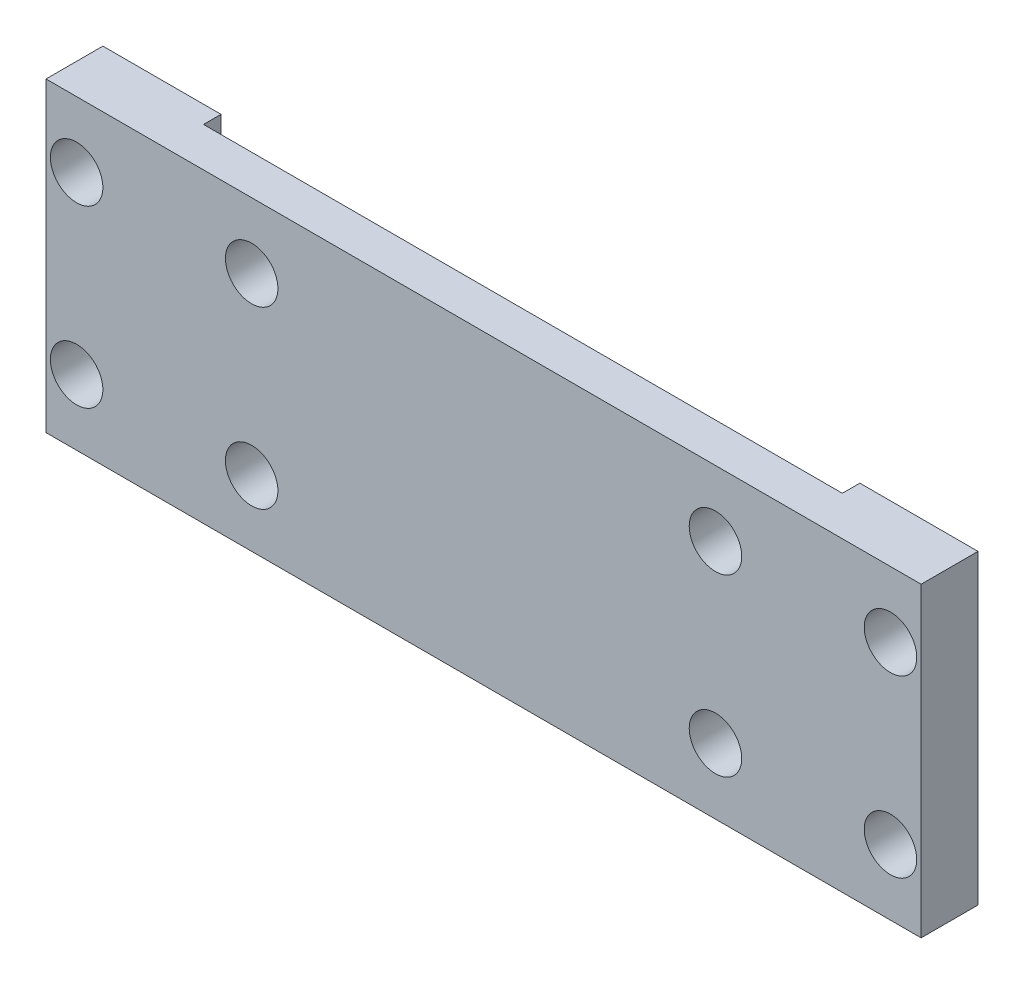
ISO-10303-21;
HEADER;
FILE_DESCRIPTION(('STEP AP214'),'2;1');
FILE_NAME('part.step','',(''),(''),'','','');
FILE_SCHEMA(('AUTOMOTIVE_DESIGN { 1 0 10303 214 1 1 1 1 }'));
ENDSEC;
DATA;
#1=APPLICATION_CONTEXT('core data for automotive mechanical design processes');
#2=APPLICATION_PROTOCOL_DEFINITION('international standard','automotive_design',2000,#1);
#3=PRODUCT_CONTEXT('',#1,'mechanical');
#4=PRODUCT('Part','Part','',(#3));
#5=PRODUCT_RELATED_PRODUCT_CATEGORY('part','',(#4));
#6=PRODUCT_DEFINITION_FORMATION('','',#4);
#7=PRODUCT_DEFINITION_CONTEXT('part definition',#1,'design');
#8=PRODUCT_DEFINITION('design','',#6,#7);
#9=PRODUCT_DEFINITION_SHAPE('','',#8);
#10=(LENGTH_UNIT() NAMED_UNIT(*) SI_UNIT(.MILLI.,.METRE.));
#11=(NAMED_UNIT(*) PLANE_ANGLE_UNIT() SI_UNIT($,.RADIAN.));
#12=(NAMED_UNIT(*) SI_UNIT($,.STERADIAN.) SOLID_ANGLE_UNIT());
#13=UNCERTAINTY_MEASURE_WITH_UNIT(LENGTH_MEASURE(1.E-05),#10,'distance_accuracy_value','');
#14=(GEOMETRIC_REPRESENTATION_CONTEXT(3) GLOBAL_UNCERTAINTY_ASSIGNED_CONTEXT((#13)) GLOBAL_UNIT_ASSIGNED_CONTEXT((#10,
#11,#12)) REPRESENTATION_CONTEXT('',''));
#15=CARTESIAN_POINT('',(0.,0.,0.));
#16=DIRECTION('',(0.,0.,1.));
#17=DIRECTION('',(1.,0.,0.));
#18=AXIS2_PLACEMENT_3D('',#15,#16,#17);
#19=CARTESIAN_POINT('',(0.,0.,2.));
#20=DIRECTION('',(0.,0.,1.));
#21=DIRECTION('',(1.,0.,0.));
#22=AXIS2_PLACEMENT_3D('',#19,#20,#21);
#23=PLANE('',#22);
#24=CARTESIAN_POINT('',(-26.5,-7.5,2.));
#25=DIRECTION('',(0.,0.,1.));
#26=DIRECTION('',(1.,0.,0.));
#27=AXIS2_PLACEMENT_3D('',#24,#25,#26);
#28=CIRCLE('',#27,3.);
#29=CARTESIAN_POINT('',(-23.5,-7.5,2.));
#30=VERTEX_POINT('',#29);
#31=EDGE_CURVE('E232',#30,#30,#28,.T.);
#32=ORIENTED_EDGE('',*,*,#31,.T.);
#33=EDGE_LOOP('',(#32));
#34=FACE_BOUND('',#33,.T.);
#35=CARTESIAN_POINT('',(-26.5,-27.5,2.));
#36=DIRECTION('',(0.,0.,1.));
#37=DIRECTION('',(1.,0.,0.));
#38=AXIS2_PLACEMENT_3D('',#35,#36,#37);
#39=CIRCLE('',#38,3.);
#40=CARTESIAN_POINT('',(-23.5,-27.5,2.));
#41=VERTEX_POINT('',#40);
#42=EDGE_CURVE('E226',#41,#41,#39,.T.);
#43=ORIENTED_EDGE('',*,*,#42,.T.);
#44=EDGE_LOOP('',(#43));
#45=FACE_BOUND('',#44,.T.);
#46=CARTESIAN_POINT('',(26.5,-27.5,2.));
#47=DIRECTION('',(0.,0.,1.));
#48=DIRECTION('',(-1.,0.,0.));
#49=AXIS2_PLACEMENT_3D('',#46,#47,#48);
#50=CIRCLE('',#49,3.);
#51=CARTESIAN_POINT('',(23.5,-27.5,2.));
#52=VERTEX_POINT('',#51);
#53=EDGE_CURVE('E220',#52,#52,#50,.T.);
#54=ORIENTED_EDGE('',*,*,#53,.T.);
#55=EDGE_LOOP('',(#54));
#56=FACE_BOUND('',#55,.T.);
#57=CARTESIAN_POINT('',(26.5,-7.49999999999999,2.));
#58=DIRECTION('',(0.,0.,1.));
#59=DIRECTION('',(-1.,0.,0.));
#60=AXIS2_PLACEMENT_3D('',#57,#58,#59);
#61=CIRCLE('',#60,3.);
#62=CARTESIAN_POINT('',(23.5,-7.49999999999999,2.));
#63=VERTEX_POINT('',#62);
#64=EDGE_CURVE('E214',#63,#63,#61,.T.);
#65=ORIENTED_EDGE('',*,*,#64,.T.);
#66=EDGE_LOOP('',(#65));
#67=FACE_BOUND('',#66,.T.);
#68=DIRECTION('',(0.,-1.,0.));
#69=VECTOR('',#68,1.);
#70=CARTESIAN_POINT('',(36.5,0.,2.));
#71=LINE('',#70,#69);
#72=CARTESIAN_POINT('',(36.5,0.,2.));
#73=VERTEX_POINT('',#72);
#74=CARTESIAN_POINT('',(36.5,-35.,2.));
#75=VERTEX_POINT('',#74);
#76=EDGE_CURVE('E113',#73,#75,#71,.T.);
#77=ORIENTED_EDGE('',*,*,#76,.T.);
#78=DIRECTION('',(1.,0.,0.));
#79=VECTOR('',#78,1.);
#80=CARTESIAN_POINT('',(-50.,-35.,2.));
#81=LINE('',#80,#79);
#82=CARTESIAN_POINT('',(-36.5,-35.,2.));
#83=VERTEX_POINT('',#82);
#84=EDGE_CURVE('E110',#83,#75,#81,.T.);
#85=ORIENTED_EDGE('',*,*,#84,.F.);
#86=DIRECTION('',(0.,1.,0.));
#87=VECTOR('',#86,1.);
#88=CARTESIAN_POINT('',(-36.5,0.,2.));
#89=LINE('',#88,#87);
#90=CARTESIAN_POINT('',(-36.5,0.,2.));
#91=VERTEX_POINT('',#90);
#92=EDGE_CURVE('E98',#83,#91,#89,.T.);
#93=ORIENTED_EDGE('',*,*,#92,.T.);
#94=DIRECTION('',(-1.,0.,0.));
#95=VECTOR('',#94,1.);
#96=CARTESIAN_POINT('',(-50.,0.,2.));
#97=LINE('',#96,#95);
#98=EDGE_CURVE('E115',#73,#91,#97,.T.);
#99=ORIENTED_EDGE('',*,*,#98,.F.);
#100=EDGE_LOOP('',(#77,#85,#93,#99));
#101=FACE_BOUND('',#100,.T.);
#102=ADVANCED_FACE('F41',(#34,#45,#56,#67,#101),#23,.F.);
#103=CARTESIAN_POINT('',(0.,0.,2.));
#104=DIRECTION('',(0.,0.,-1.));
#105=DIRECTION('',(-1.,0.,0.));
#106=AXIS2_PLACEMENT_3D('',#103,#104,#105);
#107=PLANE('',#106);
#108=CARTESIAN_POINT('',(-46.5,-7.5,2.));
#109=DIRECTION('',(0.,0.,1.));
#110=DIRECTION('',(1.,0.,0.));
#111=AXIS2_PLACEMENT_3D('',#108,#109,#110);
#112=CIRCLE('',#111,1.75);
#113=CARTESIAN_POINT('',(-44.75,-7.5,2.));
#114=VERTEX_POINT('',#113);
#115=EDGE_CURVE('E141',#114,#114,#112,.T.);
#116=ORIENTED_EDGE('',*,*,#115,.F.);
#117=EDGE_LOOP('',(#116));
#118=FACE_BOUND('',#117,.T.);
#119=CARTESIAN_POINT('',(-46.5,-7.5,2.));
#120=DIRECTION('',(0.,0.,1.));
#121=DIRECTION('',(1.,0.,0.));
#122=AXIS2_PLACEMENT_3D('',#119,#120,#121);
#123=CIRCLE('',#122,3.);
#124=CARTESIAN_POINT('',(-43.5,-7.5,2.));
#125=VERTEX_POINT('',#124);
#126=EDGE_CURVE('E122',#125,#125,#123,.T.);
#127=ORIENTED_EDGE('',*,*,#126,.T.);
#128=EDGE_LOOP('',(#127));
#129=FACE_BOUND('',#128,.T.);
#130=ADVANCED_FACE('F263',(#118,#129),#107,.F.);
#131=CARTESIAN_POINT('',(-46.5,-27.5,2.));
#132=DIRECTION('',(0.,0.,1.));
#133=DIRECTION('',(1.,0.,0.));
#134=AXIS2_PLACEMENT_3D('',#131,#132,#133);
#135=CIRCLE('',#134,1.75);
#136=CARTESIAN_POINT('',(-44.75,-27.5,2.));
#137=VERTEX_POINT('',#136);
#138=EDGE_CURVE('E135',#137,#137,#135,.T.);
#139=ORIENTED_EDGE('',*,*,#138,.F.);
#140=EDGE_LOOP('',(#139));
#141=FACE_BOUND('',#140,.T.);
#142=CARTESIAN_POINT('',(-46.5,-27.5,2.));
#143=DIRECTION('',(0.,0.,1.));
#144=DIRECTION('',(1.,0.,0.));
#145=AXIS2_PLACEMENT_3D('',#142,#143,#144);
#146=CIRCLE('',#145,3.);
#147=CARTESIAN_POINT('',(-43.5,-27.5,2.));
#148=VERTEX_POINT('',#147);
#149=EDGE_CURVE('E250',#148,#148,#146,.T.);
#150=ORIENTED_EDGE('',*,*,#149,.T.);
#151=EDGE_LOOP('',(#150));
#152=FACE_BOUND('',#151,.T.);
#153=ADVANCED_FACE('F286',(#141,#152),#107,.F.);
#154=CARTESIAN_POINT('',(0.,0.,0.));
#155=DIRECTION('',(0.,0.,-1.));
#156=DIRECTION('',(-1.,0.,0.));
#157=AXIS2_PLACEMENT_3D('',#154,#155,#156);
#158=PLANE('',#157);
#159=CARTESIAN_POINT('',(-46.5,-7.5,0.));
#160=DIRECTION('',(0.,0.,1.));
#161=DIRECTION('',(1.,0.,0.));
#162=AXIS2_PLACEMENT_3D('',#159,#160,#161);
#163=CIRCLE('',#162,1.75);
#164=CARTESIAN_POINT('',(-44.75,-7.5,0.));
#165=VERTEX_POINT('',#164);
#166=EDGE_CURVE('E138',#165,#165,#163,.T.);
#167=ORIENTED_EDGE('',*,*,#166,.T.);
#168=EDGE_LOOP('',(#167));
#169=FACE_BOUND('',#168,.T.);
#170=DIRECTION('',(0.,1.,0.));
#171=VECTOR('',#170,1.);
#172=CARTESIAN_POINT('',(-36.5,0.,0.));
#173=LINE('',#172,#171);
#174=CARTESIAN_POINT('',(-36.5,-35.,0.));
#175=VERTEX_POINT('',#174);
#176=CARTESIAN_POINT('',(-36.5,0.,0.));
#177=VERTEX_POINT('',#176);
#178=EDGE_CURVE('E97',#175,#177,#173,.T.);
#179=ORIENTED_EDGE('',*,*,#178,.F.);
#180=DIRECTION('',(1.,0.,0.));
#181=VECTOR('',#180,1.);
#182=CARTESIAN_POINT('',(-36.5,-35.,0.));
#183=LINE('',#182,#181);
#184=CARTESIAN_POINT('',(-50.,-35.,0.));
#185=VERTEX_POINT('',#184);
#186=EDGE_CURVE('E84',#185,#175,#183,.T.);
#187=ORIENTED_EDGE('',*,*,#186,.F.);
#188=DIRECTION('',(0.,-1.,0.));
#189=VECTOR('',#188,1.);
#190=CARTESIAN_POINT('',(-50.,0.,0.));
#191=LINE('',#190,#189);
#192=CARTESIAN_POINT('',(-50.,0.,0.));
#193=VERTEX_POINT('',#192);
#194=EDGE_CURVE('E74',#193,#185,#191,.T.);
#195=ORIENTED_EDGE('',*,*,#194,.F.);
#196=DIRECTION('',(-1.,0.,0.));
#197=VECTOR('',#196,1.);
#198=CARTESIAN_POINT('',(-36.5,0.,0.));
#199=LINE('',#198,#197);
#200=EDGE_CURVE('E85',#177,#193,#199,.T.);
#201=ORIENTED_EDGE('',*,*,#200,.F.);
#202=EDGE_LOOP('',(#179,#187,#195,#201));
#203=FACE_BOUND('',#202,.T.);
#204=CARTESIAN_POINT('',(-46.5,-27.5,0.));
#205=DIRECTION('',(0.,0.,1.));
#206=DIRECTION('',(1.,0.,0.));
#207=AXIS2_PLACEMENT_3D('',#204,#205,#206);
#208=CIRCLE('',#207,1.75);
#209=CARTESIAN_POINT('',(-44.75,-27.5,0.));
#210=VERTEX_POINT('',#209);
#211=EDGE_CURVE('E134',#210,#210,#208,.T.);
#212=ORIENTED_EDGE('',*,*,#211,.T.);
#213=EDGE_LOOP('',(#212));
#214=FACE_BOUND('',#213,.T.);
#215=ADVANCED_FACE('F94',(#169,#203,#214),#158,.T.);
#216=CARTESIAN_POINT('',(-36.5,0.,2.));
#217=DIRECTION('',(-1.,0.,0.));
#218=DIRECTION('',(0.,-1.,0.));
#219=AXIS2_PLACEMENT_3D('',#216,#217,#218);
#220=PLANE('',#219);
#221=ORIENTED_EDGE('',*,*,#178,.T.);
#222=DIRECTION('',(0.,0.,-1.));
#223=VECTOR('',#222,1.);
#224=CARTESIAN_POINT('',(-36.5,0.,2.));
#225=LINE('',#224,#223);
#226=EDGE_CURVE('E11',#91,#177,#225,.T.);
#227=ORIENTED_EDGE('',*,*,#226,.F.);
#228=ORIENTED_EDGE('',*,*,#92,.F.);
#229=DIRECTION('',(0.,0.,-1.));
#230=VECTOR('',#229,1.);
#231=CARTESIAN_POINT('',(-36.5,-35.,2.));
#232=LINE('',#231,#230);
#233=EDGE_CURVE('E57',#83,#175,#232,.T.);
#234=ORIENTED_EDGE('',*,*,#233,.T.);
#235=EDGE_LOOP('',(#221,#227,#228,#234));
#236=FACE_BOUND('',#235,.T.);
#237=ADVANCED_FACE('F43',(#236),#220,.F.);
#238=CARTESIAN_POINT('',(-36.5,0.,2.));
#239=DIRECTION('',(0.,-1.,0.));
#240=DIRECTION('',(1.,0.,0.));
#241=AXIS2_PLACEMENT_3D('',#238,#239,#240);
#242=PLANE('',#241);
#243=ORIENTED_EDGE('',*,*,#200,.T.);
#244=DIRECTION('',(0.,0.,-1.));
#245=VECTOR('',#244,1.);
#246=CARTESIAN_POINT('',(-50.,0.,2.));
#247=LINE('',#246,#245);
#248=CARTESIAN_POINT('',(-50.,0.,6.5));
#249=VERTEX_POINT('',#248);
#250=EDGE_CURVE('E50',#249,#193,#247,.T.);
#251=ORIENTED_EDGE('',*,*,#250,.F.);
#252=DIRECTION('',(-1.,0.,0.));
#253=VECTOR('',#252,1.);
#254=CARTESIAN_POINT('',(-50.,0.,6.5));
#255=LINE('',#254,#253);
#256=CARTESIAN_POINT('',(50.,0.,6.5));
#257=VERTEX_POINT('',#256);
#258=EDGE_CURVE('E125',#257,#249,#255,.T.);
#259=ORIENTED_EDGE('',*,*,#258,.F.);
#260=DIRECTION('',(0.,0.,-1.));
#261=VECTOR('',#260,1.);
#262=CARTESIAN_POINT('',(50.,0.,6.5));
#263=LINE('',#262,#261);
#264=CARTESIAN_POINT('',(50.,0.,0.));
#265=VERTEX_POINT('',#264);
#266=EDGE_CURVE('E128',#257,#265,#263,.T.);
#267=ORIENTED_EDGE('',*,*,#266,.T.);
#268=DIRECTION('',(-1.,0.,0.));
#269=VECTOR('',#268,1.);
#270=CARTESIAN_POINT('',(36.5,0.,0.));
#271=LINE('',#270,#269);
#272=CARTESIAN_POINT('',(36.5,0.,0.));
#273=VERTEX_POINT('',#272);
#274=EDGE_CURVE('E182',#265,#273,#271,.T.);
#275=ORIENTED_EDGE('',*,*,#274,.T.);
#276=DIRECTION('',(0.,0.,-1.));
#277=VECTOR('',#276,1.);
#278=CARTESIAN_POINT('',(36.5,0.,2.));
#279=LINE('',#278,#277);
#280=EDGE_CURVE('E155',#73,#273,#279,.T.);
#281=ORIENTED_EDGE('',*,*,#280,.F.);
#282=ORIENTED_EDGE('',*,*,#98,.T.);
#283=ORIENTED_EDGE('',*,*,#226,.T.);
#284=EDGE_LOOP('',(#243,#251,#259,#267,#275,#281,#282,#283));
#285=FACE_BOUND('',#284,.T.);
#286=ADVANCED_FACE('F147',(#285),#242,.F.);
#287=CARTESIAN_POINT('',(-50.,0.,2.));
#288=DIRECTION('',(1.,0.,0.));
#289=DIRECTION('',(0.,1.,0.));
#290=AXIS2_PLACEMENT_3D('',#287,#288,#289);
#291=PLANE('',#290);
#292=ORIENTED_EDGE('',*,*,#194,.T.);
#293=DIRECTION('',(0.,0.,-1.));
#294=VECTOR('',#293,1.);
#295=CARTESIAN_POINT('',(-50.,-35.,2.));
#296=LINE('',#295,#294);
#297=CARTESIAN_POINT('',(-50.,-35.,6.5));
#298=VERTEX_POINT('',#297);
#299=EDGE_CURVE('E79',#298,#185,#296,.T.);
#300=ORIENTED_EDGE('',*,*,#299,.F.);
#301=DIRECTION('',(0.,-1.,0.));
#302=VECTOR('',#301,1.);
#303=CARTESIAN_POINT('',(-50.,0.,6.5));
#304=LINE('',#303,#302);
#305=EDGE_CURVE('E119',#249,#298,#304,.T.);
#306=ORIENTED_EDGE('',*,*,#305,.F.);
#307=ORIENTED_EDGE('',*,*,#250,.T.);
#308=EDGE_LOOP('',(#292,#300,#306,#307));
#309=FACE_BOUND('',#308,.T.);
#310=ADVANCED_FACE('F76',(#309),#291,.F.);
#311=CARTESIAN_POINT('',(-36.5,-35.,2.));
#312=DIRECTION('',(0.,1.,0.));
#313=DIRECTION('',(-1.,0.,0.));
#314=AXIS2_PLACEMENT_3D('',#311,#312,#313);
#315=PLANE('',#314);
#316=ORIENTED_EDGE('',*,*,#186,.T.);
#317=ORIENTED_EDGE('',*,*,#233,.F.);
#318=ORIENTED_EDGE('',*,*,#84,.T.);
#319=DIRECTION('',(0.,0.,-1.));
#320=VECTOR('',#319,1.);
#321=CARTESIAN_POINT('',(36.5,-35.,2.));
#322=LINE('',#321,#320);
#323=CARTESIAN_POINT('',(36.5,-35.,0.));
#324=VERTEX_POINT('',#323);
#325=EDGE_CURVE('E196',#75,#324,#322,.T.);
#326=ORIENTED_EDGE('',*,*,#325,.T.);
#327=DIRECTION('',(1.,0.,0.));
#328=VECTOR('',#327,1.);
#329=CARTESIAN_POINT('',(36.5,-35.,0.));
#330=LINE('',#329,#328);
#331=CARTESIAN_POINT('',(50.,-35.,0.));
#332=VERTEX_POINT('',#331);
#333=EDGE_CURVE('E190',#324,#332,#330,.T.);
#334=ORIENTED_EDGE('',*,*,#333,.T.);
#335=DIRECTION('',(0.,0.,-1.));
#336=VECTOR('',#335,1.);
#337=CARTESIAN_POINT('',(50.,-35.,6.5));
#338=LINE('',#337,#336);
#339=CARTESIAN_POINT('',(50.,-35.,6.5));
#340=VERTEX_POINT('',#339);
#341=EDGE_CURVE('E131',#340,#332,#338,.T.);
#342=ORIENTED_EDGE('',*,*,#341,.F.);
#343=DIRECTION('',(1.,0.,0.));
#344=VECTOR('',#343,1.);
#345=CARTESIAN_POINT('',(-50.,-35.,6.5));
#346=LINE('',#345,#344);
#347=EDGE_CURVE('E90',#298,#340,#346,.T.);
#348=ORIENTED_EDGE('',*,*,#347,.F.);
#349=ORIENTED_EDGE('',*,*,#299,.T.);
#350=EDGE_LOOP('',(#316,#317,#318,#326,#334,#342,#348,#349));
#351=FACE_BOUND('',#350,.T.);
#352=ADVANCED_FACE('F87',(#351),#315,.F.);
#353=CARTESIAN_POINT('',(-46.5,-7.5,2.));
#354=DIRECTION('',(0.,0.,-1.));
#355=DIRECTION('',(-1.,0.,0.));
#356=AXIS2_PLACEMENT_3D('',#353,#354,#355);
#357=CYLINDRICAL_SURFACE('',#356,1.75);
#358=ORIENTED_EDGE('',*,*,#115,.T.);
#359=EDGE_LOOP('',(#358));
#360=FACE_BOUND('',#359,.T.);
#361=ORIENTED_EDGE('',*,*,#166,.F.);
#362=EDGE_LOOP('',(#361));
#363=FACE_BOUND('',#362,.T.);
#364=ADVANCED_FACE('F293',(#360,#363),#357,.F.);
#365=CARTESIAN_POINT('',(-46.5,-27.5,2.));
#366=DIRECTION('',(0.,0.,-1.));
#367=DIRECTION('',(-1.,0.,0.));
#368=AXIS2_PLACEMENT_3D('',#365,#366,#367);
#369=CYLINDRICAL_SURFACE('',#368,1.75);
#370=ORIENTED_EDGE('',*,*,#138,.T.);
#371=EDGE_LOOP('',(#370));
#372=FACE_BOUND('',#371,.T.);
#373=ORIENTED_EDGE('',*,*,#211,.F.);
#374=EDGE_LOOP('',(#373));
#375=FACE_BOUND('',#374,.T.);
#376=ADVANCED_FACE('F291',(#372,#375),#369,.F.);
#377=CARTESIAN_POINT('',(0.,0.,6.5));
#378=DIRECTION('',(0.,0.,1.));
#379=DIRECTION('',(1.,0.,0.));
#380=AXIS2_PLACEMENT_3D('',#377,#378,#379);
#381=PLANE('',#380);
#382=CARTESIAN_POINT('',(26.5,-27.5,6.5));
#383=DIRECTION('',(0.,0.,1.));
#384=DIRECTION('',(-1.,0.,0.));
#385=AXIS2_PLACEMENT_3D('',#382,#383,#384);
#386=CIRCLE('',#385,3.);
#387=CARTESIAN_POINT('',(23.5,-27.5,6.5));
#388=VERTEX_POINT('',#387);
#389=EDGE_CURVE('E223',#388,#388,#386,.T.);
#390=ORIENTED_EDGE('',*,*,#389,.F.);
#391=EDGE_LOOP('',(#390));
#392=FACE_BOUND('',#391,.T.);
#393=CARTESIAN_POINT('',(-26.5,-7.5,6.5));
#394=DIRECTION('',(0.,0.,1.));
#395=DIRECTION('',(1.,0.,0.));
#396=AXIS2_PLACEMENT_3D('',#393,#394,#395);
#397=CIRCLE('',#396,3.);
#398=CARTESIAN_POINT('',(-23.5,-7.5,6.5));
#399=VERTEX_POINT('',#398);
#400=EDGE_CURVE('E235',#399,#399,#397,.T.);
#401=ORIENTED_EDGE('',*,*,#400,.F.);
#402=EDGE_LOOP('',(#401));
#403=FACE_BOUND('',#402,.T.);
#404=CARTESIAN_POINT('',(46.5,-7.49999999999999,6.5));
#405=DIRECTION('',(0.,0.,1.));
#406=DIRECTION('',(1.,0.,0.));
#407=AXIS2_PLACEMENT_3D('',#404,#405,#406);
#408=CIRCLE('',#407,3.);
#409=CARTESIAN_POINT('',(49.5,-7.49999999999999,6.5));
#410=VERTEX_POINT('',#409);
#411=EDGE_CURVE('E247',#410,#410,#408,.T.);
#412=ORIENTED_EDGE('',*,*,#411,.F.);
#413=EDGE_LOOP('',(#412));
#414=FACE_BOUND('',#413,.T.);
#415=CARTESIAN_POINT('',(-46.5,-7.5,6.5));
#416=DIRECTION('',(0.,0.,1.));
#417=DIRECTION('',(1.,0.,0.));
#418=AXIS2_PLACEMENT_3D('',#415,#416,#417);
#419=CIRCLE('',#418,3.);
#420=CARTESIAN_POINT('',(-43.5,-7.5,6.5));
#421=VERTEX_POINT('',#420);
#422=EDGE_CURVE('E116',#421,#421,#419,.T.);
#423=ORIENTED_EDGE('',*,*,#422,.F.);
#424=EDGE_LOOP('',(#423));
#425=FACE_BOUND('',#424,.T.);
#426=ORIENTED_EDGE('',*,*,#305,.T.);
#427=ORIENTED_EDGE('',*,*,#347,.T.);
#428=DIRECTION('',(0.,1.,0.));
#429=VECTOR('',#428,1.);
#430=CARTESIAN_POINT('',(50.,0.,6.5));
#431=LINE('',#430,#429);
#432=EDGE_CURVE('E171',#340,#257,#431,.T.);
#433=ORIENTED_EDGE('',*,*,#432,.T.);
#434=ORIENTED_EDGE('',*,*,#258,.T.);
#435=EDGE_LOOP('',(#426,#427,#433,#434));
#436=FACE_BOUND('',#435,.T.);
#437=CARTESIAN_POINT('',(-46.5,-27.5,6.5));
#438=DIRECTION('',(0.,0.,1.));
#439=DIRECTION('',(1.,0.,0.));
#440=AXIS2_PLACEMENT_3D('',#437,#438,#439);
#441=CIRCLE('',#440,3.);
#442=CARTESIAN_POINT('',(-43.5,-27.5,6.5));
#443=VERTEX_POINT('',#442);
#444=EDGE_CURVE('E253',#443,#443,#441,.T.);
#445=ORIENTED_EDGE('',*,*,#444,.F.);
#446=EDGE_LOOP('',(#445));
#447=FACE_BOUND('',#446,.T.);
#448=CARTESIAN_POINT('',(46.5,-27.5,6.5));
#449=DIRECTION('',(0.,0.,1.));
#450=DIRECTION('',(1.,0.,0.));
#451=AXIS2_PLACEMENT_3D('',#448,#449,#450);
#452=CIRCLE('',#451,3.);
#453=CARTESIAN_POINT('',(49.5,-27.5,6.5));
#454=VERTEX_POINT('',#453);
#455=EDGE_CURVE('E241',#454,#454,#452,.T.);
#456=ORIENTED_EDGE('',*,*,#455,.F.);
#457=EDGE_LOOP('',(#456));
#458=FACE_BOUND('',#457,.T.);
#459=CARTESIAN_POINT('',(-26.5,-27.5,6.5));
#460=DIRECTION('',(0.,0.,1.));
#461=DIRECTION('',(1.,0.,0.));
#462=AXIS2_PLACEMENT_3D('',#459,#460,#461);
#463=CIRCLE('',#462,3.);
#464=CARTESIAN_POINT('',(-23.5,-27.5,6.5));
#465=VERTEX_POINT('',#464);
#466=EDGE_CURVE('E229',#465,#465,#463,.T.);
#467=ORIENTED_EDGE('',*,*,#466,.F.);
#468=EDGE_LOOP('',(#467));
#469=FACE_BOUND('',#468,.T.);
#470=CARTESIAN_POINT('',(26.5,-7.49999999999999,6.5));
#471=DIRECTION('',(0.,0.,1.));
#472=DIRECTION('',(-1.,0.,0.));
#473=AXIS2_PLACEMENT_3D('',#470,#471,#472);
#474=CIRCLE('',#473,3.);
#475=CARTESIAN_POINT('',(23.5,-7.49999999999999,6.5));
#476=VERTEX_POINT('',#475);
#477=EDGE_CURVE('E217',#476,#476,#474,.T.);
#478=ORIENTED_EDGE('',*,*,#477,.F.);
#479=EDGE_LOOP('',(#478));
#480=FACE_BOUND('',#479,.T.);
#481=ADVANCED_FACE('F173',(#392,#403,#414,#425,#436,#447,#458,#469,#480),#381,.T.);
#482=CARTESIAN_POINT('',(50.,0.,6.5));
#483=DIRECTION('',(-1.,0.,0.));
#484=DIRECTION('',(0.,0.,1.));
#485=AXIS2_PLACEMENT_3D('',#482,#483,#484);
#486=PLANE('',#485);
#487=ORIENTED_EDGE('',*,*,#341,.T.);
#488=DIRECTION('',(0.,1.,0.));
#489=VECTOR('',#488,1.);
#490=CARTESIAN_POINT('',(50.,0.,0.));
#491=LINE('',#490,#489);
#492=EDGE_CURVE('E180',#332,#265,#491,.T.);
#493=ORIENTED_EDGE('',*,*,#492,.T.);
#494=ORIENTED_EDGE('',*,*,#266,.F.);
#495=ORIENTED_EDGE('',*,*,#432,.F.);
#496=EDGE_LOOP('',(#487,#493,#494,#495));
#497=FACE_BOUND('',#496,.T.);
#498=ADVANCED_FACE('F177',(#497),#486,.F.);
#499=CARTESIAN_POINT('',(-46.5,-7.5,6.5));
#500=DIRECTION('',(0.,0.,-1.));
#501=DIRECTION('',(-1.,0.,0.));
#502=AXIS2_PLACEMENT_3D('',#499,#500,#501);
#503=CYLINDRICAL_SURFACE('',#502,3.);
#504=ORIENTED_EDGE('',*,*,#422,.T.);
#505=EDGE_LOOP('',(#504));
#506=FACE_BOUND('',#505,.T.);
#507=ORIENTED_EDGE('',*,*,#126,.F.);
#508=EDGE_LOOP('',(#507));
#509=FACE_BOUND('',#508,.T.);
#510=ADVANCED_FACE('F265',(#506,#509),#503,.F.);
#511=CARTESIAN_POINT('',(-46.5,-27.5,6.5));
#512=DIRECTION('',(0.,0.,-1.));
#513=DIRECTION('',(-1.,0.,0.));
#514=AXIS2_PLACEMENT_3D('',#511,#512,#513);
#515=CYLINDRICAL_SURFACE('',#514,3.);
#516=ORIENTED_EDGE('',*,*,#444,.T.);
#517=EDGE_LOOP('',(#516));
#518=FACE_BOUND('',#517,.T.);
#519=ORIENTED_EDGE('',*,*,#149,.F.);
#520=EDGE_LOOP('',(#519));
#521=FACE_BOUND('',#520,.T.);
#522=ADVANCED_FACE('F267',(#518,#521),#515,.F.);
#523=CARTESIAN_POINT('',(46.5,-7.49999999999999,6.5));
#524=DIRECTION('',(0.,0.,-1.));
#525=DIRECTION('',(-1.,0.,0.));
#526=AXIS2_PLACEMENT_3D('',#523,#524,#525);
#527=CYLINDRICAL_SURFACE('',#526,3.);
#528=ORIENTED_EDGE('',*,*,#411,.T.);
#529=EDGE_LOOP('',(#528));
#530=FACE_BOUND('',#529,.T.);
#531=CARTESIAN_POINT('',(46.5,-7.49999999999999,2.));
#532=DIRECTION('',(0.,0.,1.));
#533=DIRECTION('',(1.,0.,0.));
#534=AXIS2_PLACEMENT_3D('',#531,#532,#533);
#535=CIRCLE('',#534,3.);
#536=CARTESIAN_POINT('',(49.5,-7.49999999999999,2.));
#537=VERTEX_POINT('',#536);
#538=EDGE_CURVE('E244',#537,#537,#535,.T.);
#539=ORIENTED_EDGE('',*,*,#538,.F.);
#540=EDGE_LOOP('',(#539));
#541=FACE_BOUND('',#540,.T.);
#542=ADVANCED_FACE('F274',(#530,#541),#527,.F.);
#543=CARTESIAN_POINT('',(46.5,-27.5,6.5));
#544=DIRECTION('',(0.,0.,-1.));
#545=DIRECTION('',(-1.,0.,0.));
#546=AXIS2_PLACEMENT_3D('',#543,#544,#545);
#547=CYLINDRICAL_SURFACE('',#546,3.);
#548=ORIENTED_EDGE('',*,*,#455,.T.);
#549=EDGE_LOOP('',(#548));
#550=FACE_BOUND('',#549,.T.);
#551=CARTESIAN_POINT('',(46.5,-27.5,2.));
#552=DIRECTION('',(0.,0.,1.));
#553=DIRECTION('',(1.,0.,0.));
#554=AXIS2_PLACEMENT_3D('',#551,#552,#553);
#555=CIRCLE('',#554,3.);
#556=CARTESIAN_POINT('',(49.5,-27.5,2.));
#557=VERTEX_POINT('',#556);
#558=EDGE_CURVE('E238',#557,#557,#555,.T.);
#559=ORIENTED_EDGE('',*,*,#558,.F.);
#560=EDGE_LOOP('',(#559));
#561=FACE_BOUND('',#560,.T.);
#562=ADVANCED_FACE('F416',(#550,#561),#547,.F.);
#563=CARTESIAN_POINT('',(-26.5,-7.5,6.5));
#564=DIRECTION('',(0.,0.,-1.));
#565=DIRECTION('',(-1.,0.,0.));
#566=AXIS2_PLACEMENT_3D('',#563,#564,#565);
#567=CYLINDRICAL_SURFACE('',#566,3.);
#568=ORIENTED_EDGE('',*,*,#400,.T.);
#569=EDGE_LOOP('',(#568));
#570=FACE_BOUND('',#569,.T.);
#571=ORIENTED_EDGE('',*,*,#31,.F.);
#572=EDGE_LOOP('',(#571));
#573=FACE_BOUND('',#572,.T.);
#574=ADVANCED_FACE('F425',(#570,#573),#567,.F.);
#575=CARTESIAN_POINT('',(-26.5,-27.5,6.5));
#576=DIRECTION('',(0.,0.,-1.));
#577=DIRECTION('',(-1.,0.,0.));
#578=AXIS2_PLACEMENT_3D('',#575,#576,#577);
#579=CYLINDRICAL_SURFACE('',#578,3.);
#580=ORIENTED_EDGE('',*,*,#466,.T.);
#581=EDGE_LOOP('',(#580));
#582=FACE_BOUND('',#581,.T.);
#583=ORIENTED_EDGE('',*,*,#42,.F.);
#584=EDGE_LOOP('',(#583));
#585=FACE_BOUND('',#584,.T.);
#586=ADVANCED_FACE('F434',(#582,#585),#579,.F.);
#587=CARTESIAN_POINT('',(26.5,-27.5,6.5));
#588=DIRECTION('',(0.,0.,-1.));
#589=DIRECTION('',(-1.,0.,0.));
#590=AXIS2_PLACEMENT_3D('',#587,#588,#589);
#591=CYLINDRICAL_SURFACE('',#590,3.);
#592=ORIENTED_EDGE('',*,*,#389,.T.);
#593=EDGE_LOOP('',(#592));
#594=FACE_BOUND('',#593,.T.);
#595=ORIENTED_EDGE('',*,*,#53,.F.);
#596=EDGE_LOOP('',(#595));
#597=FACE_BOUND('',#596,.T.);
#598=ADVANCED_FACE('F443',(#594,#597),#591,.F.);
#599=CARTESIAN_POINT('',(26.5,-7.49999999999999,6.5));
#600=DIRECTION('',(0.,0.,-1.));
#601=DIRECTION('',(-1.,0.,0.));
#602=AXIS2_PLACEMENT_3D('',#599,#600,#601);
#603=CYLINDRICAL_SURFACE('',#602,3.);
#604=ORIENTED_EDGE('',*,*,#477,.T.);
#605=EDGE_LOOP('',(#604));
#606=FACE_BOUND('',#605,.T.);
#607=ORIENTED_EDGE('',*,*,#64,.F.);
#608=EDGE_LOOP('',(#607));
#609=FACE_BOUND('',#608,.T.);
#610=ADVANCED_FACE('F335',(#606,#609),#603,.F.);
#611=CARTESIAN_POINT('',(0.,0.,2.));
#612=DIRECTION('',(0.,0.,1.));
#613=DIRECTION('',(1.,0.,0.));
#614=AXIS2_PLACEMENT_3D('',#611,#612,#613);
#615=PLANE('',#614);
#616=CARTESIAN_POINT('',(46.5,-7.49999999999999,2.));
#617=DIRECTION('',(0.,0.,1.));
#618=DIRECTION('',(-1.,0.,0.));
#619=AXIS2_PLACEMENT_3D('',#616,#617,#618);
#620=CIRCLE('',#619,1.75);
#621=CARTESIAN_POINT('',(44.75,-7.49999999999999,2.));
#622=VERTEX_POINT('',#621);
#623=EDGE_CURVE('E209',#622,#622,#620,.T.);
#624=ORIENTED_EDGE('',*,*,#623,.F.);
#625=EDGE_LOOP('',(#624));
#626=FACE_BOUND('',#625,.T.);
#627=ORIENTED_EDGE('',*,*,#538,.T.);
#628=EDGE_LOOP('',(#627));
#629=FACE_BOUND('',#628,.T.);
#630=ADVANCED_FACE('F330',(#626,#629),#615,.T.);
#631=CARTESIAN_POINT('',(46.5,-27.5,2.));
#632=DIRECTION('',(0.,0.,1.));
#633=DIRECTION('',(-1.,0.,0.));
#634=AXIS2_PLACEMENT_3D('',#631,#632,#633);
#635=CIRCLE('',#634,1.75);
#636=CARTESIAN_POINT('',(44.75,-27.5,2.));
#637=VERTEX_POINT('',#636);
#638=EDGE_CURVE('E200',#637,#637,#635,.T.);
#639=ORIENTED_EDGE('',*,*,#638,.F.);
#640=EDGE_LOOP('',(#639));
#641=FACE_BOUND('',#640,.T.);
#642=ORIENTED_EDGE('',*,*,#558,.T.);
#643=EDGE_LOOP('',(#642));
#644=FACE_BOUND('',#643,.T.);
#645=ADVANCED_FACE('F334',(#641,#644),#615,.T.);
#646=CARTESIAN_POINT('',(0.,0.,0.));
#647=DIRECTION('',(0.,0.,1.));
#648=DIRECTION('',(1.,0.,0.));
#649=AXIS2_PLACEMENT_3D('',#646,#647,#648);
#650=PLANE('',#649);
#651=DIRECTION('',(0.,-1.,0.));
#652=VECTOR('',#651,1.);
#653=CARTESIAN_POINT('',(36.5,0.,0.));
#654=LINE('',#653,#652);
#655=EDGE_CURVE('E194',#273,#324,#654,.T.);
#656=ORIENTED_EDGE('',*,*,#655,.F.);
#657=ORIENTED_EDGE('',*,*,#274,.F.);
#658=ORIENTED_EDGE('',*,*,#492,.F.);
#659=ORIENTED_EDGE('',*,*,#333,.F.);
#660=EDGE_LOOP('',(#656,#657,#658,#659));
#661=FACE_BOUND('',#660,.T.);
#662=CARTESIAN_POINT('',(46.5,-27.5,0.));
#663=DIRECTION('',(0.,0.,1.));
#664=DIRECTION('',(-1.,0.,0.));
#665=AXIS2_PLACEMENT_3D('',#662,#663,#664);
#666=CIRCLE('',#665,1.75);
#667=CARTESIAN_POINT('',(44.75,-27.5,0.));
#668=VERTEX_POINT('',#667);
#669=EDGE_CURVE('E203',#668,#668,#666,.T.);
#670=ORIENTED_EDGE('',*,*,#669,.T.);
#671=EDGE_LOOP('',(#670));
#672=FACE_BOUND('',#671,.T.);
#673=CARTESIAN_POINT('',(46.5,-7.49999999999999,0.));
#674=DIRECTION('',(0.,0.,1.));
#675=DIRECTION('',(-1.,0.,0.));
#676=AXIS2_PLACEMENT_3D('',#673,#674,#675);
#677=CIRCLE('',#676,1.75);
#678=CARTESIAN_POINT('',(44.75,-7.49999999999999,0.));
#679=VERTEX_POINT('',#678);
#680=EDGE_CURVE('E211',#679,#679,#677,.T.);
#681=ORIENTED_EDGE('',*,*,#680,.T.);
#682=EDGE_LOOP('',(#681));
#683=FACE_BOUND('',#682,.T.);
#684=ADVANCED_FACE('F191',(#661,#672,#683),#650,.F.);
#685=CARTESIAN_POINT('',(36.5,0.,2.));
#686=DIRECTION('',(1.,0.,0.));
#687=DIRECTION('',(0.,1.,0.));
#688=AXIS2_PLACEMENT_3D('',#685,#686,#687);
#689=PLANE('',#688);
#690=ORIENTED_EDGE('',*,*,#655,.T.);
#691=ORIENTED_EDGE('',*,*,#325,.F.);
#692=ORIENTED_EDGE('',*,*,#76,.F.);
#693=ORIENTED_EDGE('',*,*,#280,.T.);
#694=EDGE_LOOP('',(#690,#691,#692,#693));
#695=FACE_BOUND('',#694,.T.);
#696=ADVANCED_FACE('F199',(#695),#689,.F.);
#697=CARTESIAN_POINT('',(46.5,-27.5,2.));
#698=DIRECTION('',(0.,0.,-1.));
#699=DIRECTION('',(-1.,0.,0.));
#700=AXIS2_PLACEMENT_3D('',#697,#698,#699);
#701=CYLINDRICAL_SURFACE('',#700,1.75);
#702=ORIENTED_EDGE('',*,*,#638,.T.);
#703=EDGE_LOOP('',(#702));
#704=FACE_BOUND('',#703,.T.);
#705=ORIENTED_EDGE('',*,*,#669,.F.);
#706=EDGE_LOOP('',(#705));
#707=FACE_BOUND('',#706,.T.);
#708=ADVANCED_FACE('F359',(#704,#707),#701,.F.);
#709=CARTESIAN_POINT('',(46.5,-7.49999999999999,2.));
#710=DIRECTION('',(0.,0.,-1.));
#711=DIRECTION('',(-1.,0.,0.));
#712=AXIS2_PLACEMENT_3D('',#709,#710,#711);
#713=CYLINDRICAL_SURFACE('',#712,1.75);
#714=ORIENTED_EDGE('',*,*,#623,.T.);
#715=EDGE_LOOP('',(#714));
#716=FACE_BOUND('',#715,.T.);
#717=ORIENTED_EDGE('',*,*,#680,.F.);
#718=EDGE_LOOP('',(#717));
#719=FACE_BOUND('',#718,.T.);
#720=ADVANCED_FACE('F368',(#716,#719),#713,.F.);
#721=CLOSED_SHELL('',(#102,#130,#153,#215,#237,#286,#310,#352,#364,#376,#481,#498,#510,#522,
#542,#562,#574,#586,#598,#610,#630,#645,#684,#696,#708,#720));
#722=MANIFOLD_SOLID_BREP('B2',#721);
#723=ADVANCED_BREP_SHAPE_REPRESENTATION('',(#18,#722),#14);
#724=SHAPE_DEFINITION_REPRESENTATION(#9,#723);
ENDSEC;
END-ISO-10303-21;
